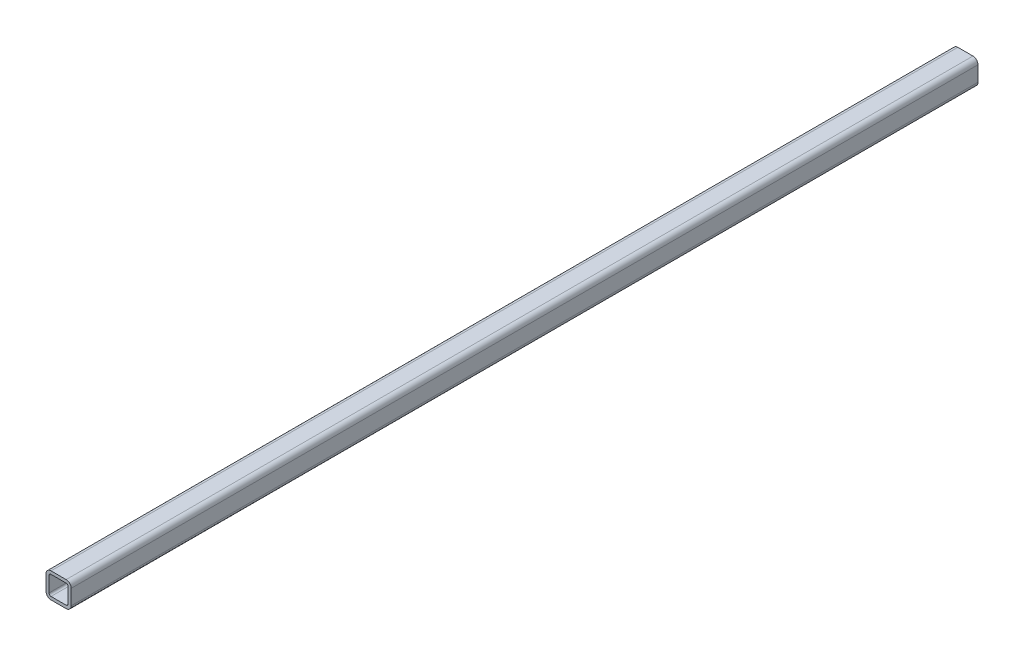
ISO-10303-21;
HEADER;
FILE_DESCRIPTION(('STEP AP214'),'2;1');
FILE_NAME('part.step','',(''),(''),'','','');
FILE_SCHEMA(('AUTOMOTIVE_DESIGN { 1 0 10303 214 1 1 1 1 }'));
ENDSEC;
DATA;
#1=APPLICATION_CONTEXT('core data for automotive mechanical design processes');
#2=APPLICATION_PROTOCOL_DEFINITION('international standard','automotive_design',2000,#1);
#3=PRODUCT_CONTEXT('',#1,'mechanical');
#4=PRODUCT('Part','Part','',(#3));
#5=PRODUCT_RELATED_PRODUCT_CATEGORY('part','',(#4));
#6=PRODUCT_DEFINITION_FORMATION('','',#4);
#7=PRODUCT_DEFINITION_CONTEXT('part definition',#1,'design');
#8=PRODUCT_DEFINITION('design','',#6,#7);
#9=PRODUCT_DEFINITION_SHAPE('','',#8);
#10=(LENGTH_UNIT() NAMED_UNIT(*) SI_UNIT(.MILLI.,.METRE.));
#11=(NAMED_UNIT(*) PLANE_ANGLE_UNIT() SI_UNIT($,.RADIAN.));
#12=(NAMED_UNIT(*) SI_UNIT($,.STERADIAN.) SOLID_ANGLE_UNIT());
#13=UNCERTAINTY_MEASURE_WITH_UNIT(LENGTH_MEASURE(1.E-05),#10,'distance_accuracy_value','');
#14=(GEOMETRIC_REPRESENTATION_CONTEXT(3) GLOBAL_UNCERTAINTY_ASSIGNED_CONTEXT((#13)) GLOBAL_UNIT_ASSIGNED_CONTEXT((#10,
#11,#12)) REPRESENTATION_CONTEXT('',''));
#15=CARTESIAN_POINT('',(0.,0.,0.));
#16=DIRECTION('',(0.,0.,1.));
#17=DIRECTION('',(1.,0.,0.));
#18=AXIS2_PLACEMENT_3D('',#15,#16,#17);
#19=CARTESIAN_POINT('',(7.5,7.5,900.));
#20=DIRECTION('',(0.,0.,-1.));
#21=DIRECTION('',(-1.,0.,0.));
#22=AXIS2_PLACEMENT_3D('',#19,#20,#21);
#23=PLANE('',#22);
#24=CARTESIAN_POINT('',(7.5,7.5,900.));
#25=DIRECTION('',(0.,0.,1.));
#26=DIRECTION('',(-1.,0.,0.));
#27=AXIS2_PLACEMENT_3D('',#24,#25,#26);
#28=CIRCLE('',#27,5.);
#29=CARTESIAN_POINT('',(12.5,7.49999999999997,900.));
#30=VERTEX_POINT('',#29);
#31=CARTESIAN_POINT('',(7.49999999999997,12.5,900.));
#32=VERTEX_POINT('',#31);
#33=EDGE_CURVE('E211',#30,#32,#28,.T.);
#34=ORIENTED_EDGE('',*,*,#33,.T.);
#35=DIRECTION('',(-1.,0.,0.));
#36=VECTOR('',#35,1.);
#37=CARTESIAN_POINT('',(-7.49999999999997,12.5,900.));
#38=LINE('',#37,#36);
#39=CARTESIAN_POINT('',(-7.49999999999997,12.5,900.));
#40=VERTEX_POINT('',#39);
#41=EDGE_CURVE('E214',#32,#40,#38,.T.);
#42=ORIENTED_EDGE('',*,*,#41,.T.);
#43=CARTESIAN_POINT('',(-7.5,7.5,900.));
#44=DIRECTION('',(0.,0.,1.));
#45=DIRECTION('',(-1.,0.,0.));
#46=AXIS2_PLACEMENT_3D('',#43,#44,#45);
#47=CIRCLE('',#46,5.);
#48=CARTESIAN_POINT('',(-12.5,7.49999999999997,900.));
#49=VERTEX_POINT('',#48);
#50=EDGE_CURVE('E217',#40,#49,#47,.T.);
#51=ORIENTED_EDGE('',*,*,#50,.T.);
#52=DIRECTION('',(0.,-1.,0.));
#53=VECTOR('',#52,1.);
#54=CARTESIAN_POINT('',(-12.5,-7.49999999999997,900.));
#55=LINE('',#54,#53);
#56=CARTESIAN_POINT('',(-12.5,-7.49999999999997,900.));
#57=VERTEX_POINT('',#56);
#58=EDGE_CURVE('E219',#49,#57,#55,.T.);
#59=ORIENTED_EDGE('',*,*,#58,.T.);
#60=CARTESIAN_POINT('',(-7.5,-7.5,900.));
#61=DIRECTION('',(0.,0.,1.));
#62=DIRECTION('',(-1.,0.,0.));
#63=AXIS2_PLACEMENT_3D('',#60,#61,#62);
#64=CIRCLE('',#63,5.);
#65=CARTESIAN_POINT('',(-7.49999999999997,-12.5,900.));
#66=VERTEX_POINT('',#65);
#67=EDGE_CURVE('E221',#57,#66,#64,.T.);
#68=ORIENTED_EDGE('',*,*,#67,.T.);
#69=DIRECTION('',(1.,0.,0.));
#70=VECTOR('',#69,1.);
#71=CARTESIAN_POINT('',(-7.49999999999997,-12.5,900.));
#72=LINE('',#71,#70);
#73=CARTESIAN_POINT('',(7.49999999999997,-12.5,900.));
#74=VERTEX_POINT('',#73);
#75=EDGE_CURVE('E223',#66,#74,#72,.T.);
#76=ORIENTED_EDGE('',*,*,#75,.T.);
#77=CARTESIAN_POINT('',(7.5,-7.5,900.));
#78=DIRECTION('',(0.,0.,1.));
#79=DIRECTION('',(1.,0.,0.));
#80=AXIS2_PLACEMENT_3D('',#77,#78,#79);
#81=CIRCLE('',#80,5.);
#82=CARTESIAN_POINT('',(12.5,-7.5,900.));
#83=VERTEX_POINT('',#82);
#84=EDGE_CURVE('E225',#74,#83,#81,.T.);
#85=ORIENTED_EDGE('',*,*,#84,.T.);
#86=DIRECTION('',(0.,1.,0.));
#87=VECTOR('',#86,1.);
#88=CARTESIAN_POINT('',(12.5,-7.49999999999997,900.));
#89=LINE('',#88,#87);
#90=EDGE_CURVE('E227',#83,#30,#89,.T.);
#91=ORIENTED_EDGE('',*,*,#90,.T.);
#92=EDGE_LOOP('',(#34,#42,#51,#59,#68,#76,#85,#91));
#93=FACE_BOUND('',#92,.T.);
#94=CARTESIAN_POINT('',(-7.49999999999999,-7.49999999999997,900.));
#95=DIRECTION('',(0.,0.,1.));
#96=DIRECTION('',(1.,0.,0.));
#97=AXIS2_PLACEMENT_3D('',#94,#95,#96);
#98=CIRCLE('',#97,2.);
#99=CARTESIAN_POINT('',(-9.49999999999999,-7.49999999999995,900.));
#100=VERTEX_POINT('',#99);
#101=CARTESIAN_POINT('',(-7.49999999999997,-9.49999999999997,900.));
#102=VERTEX_POINT('',#101);
#103=EDGE_CURVE('E146',#100,#102,#98,.T.);
#104=ORIENTED_EDGE('',*,*,#103,.F.);
#105=DIRECTION('',(0.,-1.,0.));
#106=VECTOR('',#105,1.);
#107=CARTESIAN_POINT('',(-9.49999999999999,7.49999999999998,900.));
#108=LINE('',#107,#106);
#109=CARTESIAN_POINT('',(-9.49999999999999,7.49999999999998,900.));
#110=VERTEX_POINT('',#109);
#111=EDGE_CURVE('E179',#110,#100,#108,.T.);
#112=ORIENTED_EDGE('',*,*,#111,.F.);
#113=CARTESIAN_POINT('',(-7.49999999999999,7.49999999999999,900.));
#114=DIRECTION('',(0.,0.,1.));
#115=DIRECTION('',(-1.,0.,0.));
#116=AXIS2_PLACEMENT_3D('',#113,#114,#115);
#117=CIRCLE('',#116,2.);
#118=CARTESIAN_POINT('',(-7.49999999999997,9.49999999999999,900.));
#119=VERTEX_POINT('',#118);
#120=EDGE_CURVE('E177',#119,#110,#117,.T.);
#121=ORIENTED_EDGE('',*,*,#120,.F.);
#122=DIRECTION('',(-1.,0.,0.));
#123=VECTOR('',#122,1.);
#124=CARTESIAN_POINT('',(7.49999999999994,9.49999999999996,900.));
#125=LINE('',#124,#123);
#126=CARTESIAN_POINT('',(7.49999999999994,9.49999999999996,900.));
#127=VERTEX_POINT('',#126);
#128=EDGE_CURVE('E175',#127,#119,#125,.T.);
#129=ORIENTED_EDGE('',*,*,#128,.F.);
#130=CARTESIAN_POINT('',(7.49999999999995,7.49999999999996,900.));
#131=DIRECTION('',(0.,0.,1.));
#132=DIRECTION('',(1.,0.,0.));
#133=AXIS2_PLACEMENT_3D('',#130,#131,#132);
#134=CIRCLE('',#133,2.);
#135=CARTESIAN_POINT('',(9.49999999999995,7.49999999999994,900.));
#136=VERTEX_POINT('',#135);
#137=EDGE_CURVE('E173',#136,#127,#134,.T.);
#138=ORIENTED_EDGE('',*,*,#137,.F.);
#139=DIRECTION('',(0.,1.,0.));
#140=VECTOR('',#139,1.);
#141=CARTESIAN_POINT('',(9.49999999999995,-7.49999999999995,900.));
#142=LINE('',#141,#140);
#143=CARTESIAN_POINT('',(9.49999999999995,-7.49999999999995,900.));
#144=VERTEX_POINT('',#143);
#145=EDGE_CURVE('E169',#144,#136,#142,.T.);
#146=ORIENTED_EDGE('',*,*,#145,.F.);
#147=CARTESIAN_POINT('',(7.49999999999995,-7.49999999999997,900.));
#148=DIRECTION('',(0.,0.,1.));
#149=DIRECTION('',(1.,0.,0.));
#150=AXIS2_PLACEMENT_3D('',#147,#148,#149);
#151=CIRCLE('',#150,2.);
#152=CARTESIAN_POINT('',(7.49999999999994,-9.49999999999997,900.));
#153=VERTEX_POINT('',#152);
#154=EDGE_CURVE('E167',#153,#144,#151,.T.);
#155=ORIENTED_EDGE('',*,*,#154,.F.);
#156=DIRECTION('',(1.,0.,0.));
#157=VECTOR('',#156,1.);
#158=CARTESIAN_POINT('',(-7.49999999999997,-9.49999999999997,900.));
#159=LINE('',#158,#157);
#160=EDGE_CURVE('E154',#102,#153,#159,.T.);
#161=ORIENTED_EDGE('',*,*,#160,.F.);
#162=EDGE_LOOP('',(#104,#112,#121,#129,#138,#146,#155,#161));
#163=FACE_BOUND('',#162,.T.);
#164=ADVANCED_FACE('F33',(#93,#163),#23,.F.);
#165=CARTESIAN_POINT('',(7.5,7.5,0.));
#166=DIRECTION('',(0.,0.,-1.));
#167=DIRECTION('',(-1.,0.,0.));
#168=AXIS2_PLACEMENT_3D('',#165,#166,#167);
#169=PLANE('',#168);
#170=CARTESIAN_POINT('',(7.5,7.5,0.));
#171=DIRECTION('',(0.,0.,1.));
#172=DIRECTION('',(-1.,0.,0.));
#173=AXIS2_PLACEMENT_3D('',#170,#171,#172);
#174=CIRCLE('',#173,5.);
#175=CARTESIAN_POINT('',(12.5,7.49999999999997,0.));
#176=VERTEX_POINT('',#175);
#177=CARTESIAN_POINT('',(7.49999999999997,12.5,0.));
#178=VERTEX_POINT('',#177);
#179=EDGE_CURVE('E162',#176,#178,#174,.T.);
#180=ORIENTED_EDGE('',*,*,#179,.F.);
#181=DIRECTION('',(0.,1.,0.));
#182=VECTOR('',#181,1.);
#183=CARTESIAN_POINT('',(12.5,-7.49999999999997,0.));
#184=LINE('',#183,#182);
#185=CARTESIAN_POINT('',(12.5,-7.5,0.));
#186=VERTEX_POINT('',#185);
#187=EDGE_CURVE('E215',#186,#176,#184,.T.);
#188=ORIENTED_EDGE('',*,*,#187,.F.);
#189=CARTESIAN_POINT('',(7.5,-7.5,0.));
#190=DIRECTION('',(0.,0.,1.));
#191=DIRECTION('',(1.,0.,0.));
#192=AXIS2_PLACEMENT_3D('',#189,#190,#191);
#193=CIRCLE('',#192,5.);
#194=CARTESIAN_POINT('',(7.49999999999997,-12.5,0.));
#195=VERTEX_POINT('',#194);
#196=EDGE_CURVE('E242',#195,#186,#193,.T.);
#197=ORIENTED_EDGE('',*,*,#196,.F.);
#198=DIRECTION('',(1.,0.,0.));
#199=VECTOR('',#198,1.);
#200=CARTESIAN_POINT('',(-7.49999999999997,-12.5,0.));
#201=LINE('',#200,#199);
#202=CARTESIAN_POINT('',(-7.49999999999997,-12.5,0.));
#203=VERTEX_POINT('',#202);
#204=EDGE_CURVE('E240',#203,#195,#201,.T.);
#205=ORIENTED_EDGE('',*,*,#204,.F.);
#206=CARTESIAN_POINT('',(-7.5,-7.5,0.));
#207=DIRECTION('',(0.,0.,1.));
#208=DIRECTION('',(-1.,0.,0.));
#209=AXIS2_PLACEMENT_3D('',#206,#207,#208);
#210=CIRCLE('',#209,5.);
#211=CARTESIAN_POINT('',(-12.5,-7.49999999999997,0.));
#212=VERTEX_POINT('',#211);
#213=EDGE_CURVE('E238',#212,#203,#210,.T.);
#214=ORIENTED_EDGE('',*,*,#213,.F.);
#215=DIRECTION('',(0.,-1.,0.));
#216=VECTOR('',#215,1.);
#217=CARTESIAN_POINT('',(-12.5,-7.49999999999997,0.));
#218=LINE('',#217,#216);
#219=CARTESIAN_POINT('',(-12.5,7.49999999999997,0.));
#220=VERTEX_POINT('',#219);
#221=EDGE_CURVE('E236',#220,#212,#218,.T.);
#222=ORIENTED_EDGE('',*,*,#221,.F.);
#223=CARTESIAN_POINT('',(-7.5,7.5,0.));
#224=DIRECTION('',(0.,0.,1.));
#225=DIRECTION('',(-1.,0.,0.));
#226=AXIS2_PLACEMENT_3D('',#223,#224,#225);
#227=CIRCLE('',#226,5.);
#228=CARTESIAN_POINT('',(-7.49999999999997,12.5,0.));
#229=VERTEX_POINT('',#228);
#230=EDGE_CURVE('E234',#229,#220,#227,.T.);
#231=ORIENTED_EDGE('',*,*,#230,.F.);
#232=DIRECTION('',(-1.,0.,0.));
#233=VECTOR('',#232,1.);
#234=CARTESIAN_POINT('',(-7.49999999999997,12.5,0.));
#235=LINE('',#234,#233);
#236=EDGE_CURVE('E232',#178,#229,#235,.T.);
#237=ORIENTED_EDGE('',*,*,#236,.F.);
#238=EDGE_LOOP('',(#180,#188,#197,#205,#214,#222,#231,#237));
#239=FACE_BOUND('',#238,.T.);
#240=DIRECTION('',(0.,-1.,0.));
#241=VECTOR('',#240,1.);
#242=CARTESIAN_POINT('',(-9.49999999999999,7.49999999999998,0.));
#243=LINE('',#242,#241);
#244=CARTESIAN_POINT('',(-9.49999999999999,7.49999999999998,0.));
#245=VERTEX_POINT('',#244);
#246=CARTESIAN_POINT('',(-9.49999999999998,-7.49999999999995,0.));
#247=VERTEX_POINT('',#246);
#248=EDGE_CURVE('E155',#245,#247,#243,.T.);
#249=ORIENTED_EDGE('',*,*,#248,.T.);
#250=CARTESIAN_POINT('',(-7.49999999999999,-7.49999999999997,0.));
#251=DIRECTION('',(0.,0.,1.));
#252=DIRECTION('',(1.,0.,0.));
#253=AXIS2_PLACEMENT_3D('',#250,#251,#252);
#254=CIRCLE('',#253,2.);
#255=CARTESIAN_POINT('',(-7.49999999999997,-9.49999999999997,0.));
#256=VERTEX_POINT('',#255);
#257=EDGE_CURVE('E56',#247,#256,#254,.T.);
#258=ORIENTED_EDGE('',*,*,#257,.T.);
#259=DIRECTION('',(1.,0.,0.));
#260=VECTOR('',#259,1.);
#261=CARTESIAN_POINT('',(-7.49999999999997,-9.49999999999997,0.));
#262=LINE('',#261,#260);
#263=CARTESIAN_POINT('',(7.49999999999994,-9.49999999999997,0.));
#264=VERTEX_POINT('',#263);
#265=EDGE_CURVE('E161',#256,#264,#262,.T.);
#266=ORIENTED_EDGE('',*,*,#265,.T.);
#267=CARTESIAN_POINT('',(7.49999999999995,-7.49999999999997,0.));
#268=DIRECTION('',(0.,0.,1.));
#269=DIRECTION('',(1.,0.,0.));
#270=AXIS2_PLACEMENT_3D('',#267,#268,#269);
#271=CIRCLE('',#270,2.);
#272=CARTESIAN_POINT('',(9.49999999999995,-7.49999999999995,0.));
#273=VERTEX_POINT('',#272);
#274=EDGE_CURVE('E183',#264,#273,#271,.T.);
#275=ORIENTED_EDGE('',*,*,#274,.T.);
#276=DIRECTION('',(0.,1.,0.));
#277=VECTOR('',#276,1.);
#278=CARTESIAN_POINT('',(9.49999999999995,-7.49999999999995,0.));
#279=LINE('',#278,#277);
#280=CARTESIAN_POINT('',(9.49999999999995,7.49999999999994,0.));
#281=VERTEX_POINT('',#280);
#282=EDGE_CURVE('E186',#273,#281,#279,.T.);
#283=ORIENTED_EDGE('',*,*,#282,.T.);
#284=CARTESIAN_POINT('',(7.49999999999995,7.49999999999996,0.));
#285=DIRECTION('',(0.,0.,1.));
#286=DIRECTION('',(1.,0.,0.));
#287=AXIS2_PLACEMENT_3D('',#284,#285,#286);
#288=CIRCLE('',#287,2.);
#289=CARTESIAN_POINT('',(7.49999999999994,9.49999999999996,0.));
#290=VERTEX_POINT('',#289);
#291=EDGE_CURVE('E189',#281,#290,#288,.T.);
#292=ORIENTED_EDGE('',*,*,#291,.T.);
#293=DIRECTION('',(-1.,0.,0.));
#294=VECTOR('',#293,1.);
#295=CARTESIAN_POINT('',(7.49999999999994,9.49999999999996,0.));
#296=LINE('',#295,#294);
#297=CARTESIAN_POINT('',(-7.49999999999997,9.49999999999999,0.));
#298=VERTEX_POINT('',#297);
#299=EDGE_CURVE('E192',#290,#298,#296,.T.);
#300=ORIENTED_EDGE('',*,*,#299,.T.);
#301=CARTESIAN_POINT('',(-7.49999999999999,7.49999999999999,0.));
#302=DIRECTION('',(0.,0.,1.));
#303=DIRECTION('',(-1.,0.,0.));
#304=AXIS2_PLACEMENT_3D('',#301,#302,#303);
#305=CIRCLE('',#304,2.);
#306=EDGE_CURVE('E195',#298,#245,#305,.T.);
#307=ORIENTED_EDGE('',*,*,#306,.T.);
#308=EDGE_LOOP('',(#249,#258,#266,#275,#283,#292,#300,#307));
#309=FACE_BOUND('',#308,.T.);
#310=ADVANCED_FACE('F272',(#239,#309),#169,.T.);
#311=CARTESIAN_POINT('',(7.5,7.5,900.));
#312=DIRECTION('',(0.,0.,-1.));
#313=DIRECTION('',(-1.,0.,0.));
#314=AXIS2_PLACEMENT_3D('',#311,#312,#313);
#315=CYLINDRICAL_SURFACE('',#314,5.);
#316=ORIENTED_EDGE('',*,*,#179,.T.);
#317=DIRECTION('',(0.,0.,-1.));
#318=VECTOR('',#317,1.);
#319=CARTESIAN_POINT('',(7.49999999999997,12.5,900.));
#320=LINE('',#319,#318);
#321=EDGE_CURVE('E11',#32,#178,#320,.T.);
#322=ORIENTED_EDGE('',*,*,#321,.F.);
#323=ORIENTED_EDGE('',*,*,#33,.F.);
#324=DIRECTION('',(0.,0.,-1.));
#325=VECTOR('',#324,1.);
#326=CARTESIAN_POINT('',(12.5,7.49999999999997,900.));
#327=LINE('',#326,#325);
#328=EDGE_CURVE('E229',#30,#176,#327,.T.);
#329=ORIENTED_EDGE('',*,*,#328,.T.);
#330=EDGE_LOOP('',(#316,#322,#323,#329));
#331=FACE_BOUND('',#330,.T.);
#332=ADVANCED_FACE('F35',(#331),#315,.T.);
#333=CARTESIAN_POINT('',(-7.49999999999997,12.5,900.));
#334=DIRECTION('',(0.,-1.,0.));
#335=DIRECTION('',(0.,0.,-1.));
#336=AXIS2_PLACEMENT_3D('',#333,#334,#335);
#337=PLANE('',#336);
#338=ORIENTED_EDGE('',*,*,#236,.T.);
#339=DIRECTION('',(0.,0.,-1.));
#340=VECTOR('',#339,1.);
#341=CARTESIAN_POINT('',(-7.49999999999997,12.5,900.));
#342=LINE('',#341,#340);
#343=EDGE_CURVE('E41',#40,#229,#342,.T.);
#344=ORIENTED_EDGE('',*,*,#343,.F.);
#345=ORIENTED_EDGE('',*,*,#41,.F.);
#346=ORIENTED_EDGE('',*,*,#321,.T.);
#347=EDGE_LOOP('',(#338,#344,#345,#346));
#348=FACE_BOUND('',#347,.T.);
#349=ADVANCED_FACE('F289',(#348),#337,.F.);
#350=CARTESIAN_POINT('',(-7.5,7.5,900.));
#351=DIRECTION('',(0.,0.,-1.));
#352=DIRECTION('',(-1.,0.,0.));
#353=AXIS2_PLACEMENT_3D('',#350,#351,#352);
#354=CYLINDRICAL_SURFACE('',#353,5.);
#355=ORIENTED_EDGE('',*,*,#230,.T.);
#356=DIRECTION('',(0.,0.,-1.));
#357=VECTOR('',#356,1.);
#358=CARTESIAN_POINT('',(-12.5,7.49999999999997,900.));
#359=LINE('',#358,#357);
#360=EDGE_CURVE('E259',#49,#220,#359,.T.);
#361=ORIENTED_EDGE('',*,*,#360,.F.);
#362=ORIENTED_EDGE('',*,*,#50,.F.);
#363=ORIENTED_EDGE('',*,*,#343,.T.);
#364=EDGE_LOOP('',(#355,#361,#362,#363));
#365=FACE_BOUND('',#364,.T.);
#366=ADVANCED_FACE('F266',(#365),#354,.T.);
#367=CARTESIAN_POINT('',(-12.5,-7.49999999999997,900.));
#368=DIRECTION('',(1.,0.,0.));
#369=DIRECTION('',(0.,0.,-1.));
#370=AXIS2_PLACEMENT_3D('',#367,#368,#369);
#371=PLANE('',#370);
#372=ORIENTED_EDGE('',*,*,#221,.T.);
#373=DIRECTION('',(0.,0.,-1.));
#374=VECTOR('',#373,1.);
#375=CARTESIAN_POINT('',(-12.5,-7.49999999999997,900.));
#376=LINE('',#375,#374);
#377=EDGE_CURVE('E256',#57,#212,#376,.T.);
#378=ORIENTED_EDGE('',*,*,#377,.F.);
#379=ORIENTED_EDGE('',*,*,#58,.F.);
#380=ORIENTED_EDGE('',*,*,#360,.T.);
#381=EDGE_LOOP('',(#372,#378,#379,#380));
#382=FACE_BOUND('',#381,.T.);
#383=ADVANCED_FACE('F278',(#382),#371,.F.);
#384=CARTESIAN_POINT('',(-7.5,-7.5,900.));
#385=DIRECTION('',(0.,0.,-1.));
#386=DIRECTION('',(-1.,0.,0.));
#387=AXIS2_PLACEMENT_3D('',#384,#385,#386);
#388=CYLINDRICAL_SURFACE('',#387,5.);
#389=ORIENTED_EDGE('',*,*,#213,.T.);
#390=DIRECTION('',(0.,0.,-1.));
#391=VECTOR('',#390,1.);
#392=CARTESIAN_POINT('',(-7.49999999999997,-12.5,900.));
#393=LINE('',#392,#391);
#394=EDGE_CURVE('E253',#66,#203,#393,.T.);
#395=ORIENTED_EDGE('',*,*,#394,.F.);
#396=ORIENTED_EDGE('',*,*,#67,.F.);
#397=ORIENTED_EDGE('',*,*,#377,.T.);
#398=EDGE_LOOP('',(#389,#395,#396,#397));
#399=FACE_BOUND('',#398,.T.);
#400=ADVANCED_FACE('F282',(#399),#388,.T.);
#401=CARTESIAN_POINT('',(-7.49999999999997,-12.5,900.));
#402=DIRECTION('',(0.,1.,0.));
#403=DIRECTION('',(0.,0.,1.));
#404=AXIS2_PLACEMENT_3D('',#401,#402,#403);
#405=PLANE('',#404);
#406=ORIENTED_EDGE('',*,*,#204,.T.);
#407=DIRECTION('',(0.,0.,-1.));
#408=VECTOR('',#407,1.);
#409=CARTESIAN_POINT('',(7.49999999999997,-12.5,900.));
#410=LINE('',#409,#408);
#411=EDGE_CURVE('E250',#74,#195,#410,.T.);
#412=ORIENTED_EDGE('',*,*,#411,.F.);
#413=ORIENTED_EDGE('',*,*,#75,.F.);
#414=ORIENTED_EDGE('',*,*,#394,.T.);
#415=EDGE_LOOP('',(#406,#412,#413,#414));
#416=FACE_BOUND('',#415,.T.);
#417=ADVANCED_FACE('F302',(#416),#405,.F.);
#418=CARTESIAN_POINT('',(7.5,-7.5,900.));
#419=DIRECTION('',(0.,0.,-1.));
#420=DIRECTION('',(-1.,0.,0.));
#421=AXIS2_PLACEMENT_3D('',#418,#419,#420);
#422=CYLINDRICAL_SURFACE('',#421,5.);
#423=ORIENTED_EDGE('',*,*,#196,.T.);
#424=DIRECTION('',(0.,0.,-1.));
#425=VECTOR('',#424,1.);
#426=CARTESIAN_POINT('',(12.5,-7.5,900.));
#427=LINE('',#426,#425);
#428=EDGE_CURVE('E247',#83,#186,#427,.T.);
#429=ORIENTED_EDGE('',*,*,#428,.F.);
#430=ORIENTED_EDGE('',*,*,#84,.F.);
#431=ORIENTED_EDGE('',*,*,#411,.T.);
#432=EDGE_LOOP('',(#423,#429,#430,#431));
#433=FACE_BOUND('',#432,.T.);
#434=ADVANCED_FACE('F300',(#433),#422,.T.);
#435=CARTESIAN_POINT('',(12.5,-7.49999999999997,900.));
#436=DIRECTION('',(-1.,0.,0.));
#437=DIRECTION('',(0.,0.,1.));
#438=AXIS2_PLACEMENT_3D('',#435,#436,#437);
#439=PLANE('',#438);
#440=ORIENTED_EDGE('',*,*,#187,.T.);
#441=ORIENTED_EDGE('',*,*,#328,.F.);
#442=ORIENTED_EDGE('',*,*,#90,.F.);
#443=ORIENTED_EDGE('',*,*,#428,.T.);
#444=EDGE_LOOP('',(#440,#441,#442,#443));
#445=FACE_BOUND('',#444,.T.);
#446=ADVANCED_FACE('F295',(#445),#439,.F.);
#447=CARTESIAN_POINT('',(-7.49999999999999,-7.49999999999997,900.));
#448=DIRECTION('',(0.,0.,-1.));
#449=DIRECTION('',(-1.,0.,0.));
#450=AXIS2_PLACEMENT_3D('',#447,#448,#449);
#451=CYLINDRICAL_SURFACE('',#450,2.);
#452=ORIENTED_EDGE('',*,*,#257,.F.);
#453=DIRECTION('',(0.,0.,-1.));
#454=VECTOR('',#453,1.);
#455=CARTESIAN_POINT('',(-9.49999999999999,-7.49999999999995,900.));
#456=LINE('',#455,#454);
#457=EDGE_CURVE('E150',#100,#247,#456,.T.);
#458=ORIENTED_EDGE('',*,*,#457,.F.);
#459=ORIENTED_EDGE('',*,*,#103,.T.);
#460=DIRECTION('',(0.,0.,-1.));
#461=VECTOR('',#460,1.);
#462=CARTESIAN_POINT('',(-7.49999999999997,-9.49999999999997,900.));
#463=LINE('',#462,#461);
#464=EDGE_CURVE('E149',#102,#256,#463,.T.);
#465=ORIENTED_EDGE('',*,*,#464,.T.);
#466=EDGE_LOOP('',(#452,#458,#459,#465));
#467=FACE_BOUND('',#466,.T.);
#468=ADVANCED_FACE('F148',(#467),#451,.F.);
#469=CARTESIAN_POINT('',(-7.49999999999997,-9.49999999999997,900.));
#470=DIRECTION('',(0.,1.,0.));
#471=DIRECTION('',(0.,0.,1.));
#472=AXIS2_PLACEMENT_3D('',#469,#470,#471);
#473=PLANE('',#472);
#474=ORIENTED_EDGE('',*,*,#265,.F.);
#475=ORIENTED_EDGE('',*,*,#464,.F.);
#476=ORIENTED_EDGE('',*,*,#160,.T.);
#477=DIRECTION('',(0.,0.,-1.));
#478=VECTOR('',#477,1.);
#479=CARTESIAN_POINT('',(7.49999999999994,-9.49999999999997,900.));
#480=LINE('',#479,#478);
#481=EDGE_CURVE('E163',#153,#264,#480,.T.);
#482=ORIENTED_EDGE('',*,*,#481,.T.);
#483=EDGE_LOOP('',(#474,#475,#476,#482));
#484=FACE_BOUND('',#483,.T.);
#485=ADVANCED_FACE('F158',(#484),#473,.T.);
#486=CARTESIAN_POINT('',(7.49999999999995,-7.49999999999997,900.));
#487=DIRECTION('',(0.,0.,-1.));
#488=DIRECTION('',(-1.,0.,0.));
#489=AXIS2_PLACEMENT_3D('',#486,#487,#488);
#490=CYLINDRICAL_SURFACE('',#489,2.);
#491=ORIENTED_EDGE('',*,*,#274,.F.);
#492=ORIENTED_EDGE('',*,*,#481,.F.);
#493=ORIENTED_EDGE('',*,*,#154,.T.);
#494=DIRECTION('',(0.,0.,-1.));
#495=VECTOR('',#494,1.);
#496=CARTESIAN_POINT('',(9.49999999999995,-7.49999999999995,900.));
#497=LINE('',#496,#495);
#498=EDGE_CURVE('E208',#144,#273,#497,.T.);
#499=ORIENTED_EDGE('',*,*,#498,.T.);
#500=EDGE_LOOP('',(#491,#492,#493,#499));
#501=FACE_BOUND('',#500,.T.);
#502=ADVANCED_FACE('F327',(#501),#490,.F.);
#503=CARTESIAN_POINT('',(9.49999999999995,-7.49999999999995,900.));
#504=DIRECTION('',(-1.,0.,0.));
#505=DIRECTION('',(0.,0.,1.));
#506=AXIS2_PLACEMENT_3D('',#503,#504,#505);
#507=PLANE('',#506);
#508=ORIENTED_EDGE('',*,*,#282,.F.);
#509=ORIENTED_EDGE('',*,*,#498,.F.);
#510=ORIENTED_EDGE('',*,*,#145,.T.);
#511=DIRECTION('',(0.,0.,-1.));
#512=VECTOR('',#511,1.);
#513=CARTESIAN_POINT('',(9.49999999999995,7.49999999999994,900.));
#514=LINE('',#513,#512);
#515=EDGE_CURVE('E206',#136,#281,#514,.T.);
#516=ORIENTED_EDGE('',*,*,#515,.T.);
#517=EDGE_LOOP('',(#508,#509,#510,#516));
#518=FACE_BOUND('',#517,.T.);
#519=ADVANCED_FACE('F331',(#518),#507,.T.);
#520=CARTESIAN_POINT('',(7.49999999999995,7.49999999999996,900.));
#521=DIRECTION('',(0.,0.,-1.));
#522=DIRECTION('',(-1.,0.,0.));
#523=AXIS2_PLACEMENT_3D('',#520,#521,#522);
#524=CYLINDRICAL_SURFACE('',#523,2.);
#525=ORIENTED_EDGE('',*,*,#291,.F.);
#526=ORIENTED_EDGE('',*,*,#515,.F.);
#527=ORIENTED_EDGE('',*,*,#137,.T.);
#528=DIRECTION('',(0.,0.,-1.));
#529=VECTOR('',#528,1.);
#530=CARTESIAN_POINT('',(7.49999999999994,9.49999999999996,900.));
#531=LINE('',#530,#529);
#532=EDGE_CURVE('E204',#127,#290,#531,.T.);
#533=ORIENTED_EDGE('',*,*,#532,.T.);
#534=EDGE_LOOP('',(#525,#526,#527,#533));
#535=FACE_BOUND('',#534,.T.);
#536=ADVANCED_FACE('F337',(#535),#524,.F.);
#537=CARTESIAN_POINT('',(7.49999999999994,9.49999999999996,900.));
#538=DIRECTION('',(0.,-1.,0.));
#539=DIRECTION('',(1.,0.,0.));
#540=AXIS2_PLACEMENT_3D('',#537,#538,#539);
#541=PLANE('',#540);
#542=ORIENTED_EDGE('',*,*,#299,.F.);
#543=ORIENTED_EDGE('',*,*,#532,.F.);
#544=ORIENTED_EDGE('',*,*,#128,.T.);
#545=DIRECTION('',(0.,0.,-1.));
#546=VECTOR('',#545,1.);
#547=CARTESIAN_POINT('',(-7.49999999999997,9.49999999999999,900.));
#548=LINE('',#547,#546);
#549=EDGE_CURVE('E202',#119,#298,#548,.T.);
#550=ORIENTED_EDGE('',*,*,#549,.T.);
#551=EDGE_LOOP('',(#542,#543,#544,#550));
#552=FACE_BOUND('',#551,.T.);
#553=ADVANCED_FACE('F341',(#552),#541,.T.);
#554=CARTESIAN_POINT('',(-7.49999999999999,7.49999999999999,900.));
#555=DIRECTION('',(0.,0.,-1.));
#556=DIRECTION('',(-1.,0.,0.));
#557=AXIS2_PLACEMENT_3D('',#554,#555,#556);
#558=CYLINDRICAL_SURFACE('',#557,2.);
#559=ORIENTED_EDGE('',*,*,#306,.F.);
#560=ORIENTED_EDGE('',*,*,#549,.F.);
#561=ORIENTED_EDGE('',*,*,#120,.T.);
#562=DIRECTION('',(0.,0.,-1.));
#563=VECTOR('',#562,1.);
#564=CARTESIAN_POINT('',(-9.49999999999999,7.49999999999998,900.));
#565=LINE('',#564,#563);
#566=EDGE_CURVE('E48',#110,#245,#565,.T.);
#567=ORIENTED_EDGE('',*,*,#566,.T.);
#568=EDGE_LOOP('',(#559,#560,#561,#567));
#569=FACE_BOUND('',#568,.T.);
#570=ADVANCED_FACE('F345',(#569),#558,.F.);
#571=CARTESIAN_POINT('',(-9.49999999999999,7.49999999999998,900.));
#572=DIRECTION('',(1.,0.,0.));
#573=DIRECTION('',(0.,1.,0.));
#574=AXIS2_PLACEMENT_3D('',#571,#572,#573);
#575=PLANE('',#574);
#576=ORIENTED_EDGE('',*,*,#248,.F.);
#577=ORIENTED_EDGE('',*,*,#566,.F.);
#578=ORIENTED_EDGE('',*,*,#111,.T.);
#579=ORIENTED_EDGE('',*,*,#457,.T.);
#580=EDGE_LOOP('',(#576,#577,#578,#579));
#581=FACE_BOUND('',#580,.T.);
#582=ADVANCED_FACE('F349',(#581),#575,.T.);
#583=CLOSED_SHELL('',(#164,#310,#332,#349,#366,#383,#400,#417,#434,#446,#468,#485,#502,#519,
#536,#553,#570,#582));
#584=MANIFOLD_SOLID_BREP('B2',#583);
#585=ADVANCED_BREP_SHAPE_REPRESENTATION('',(#18,#584),#14);
#586=SHAPE_DEFINITION_REPRESENTATION(#9,#585);
ENDSEC;
END-ISO-10303-21;
